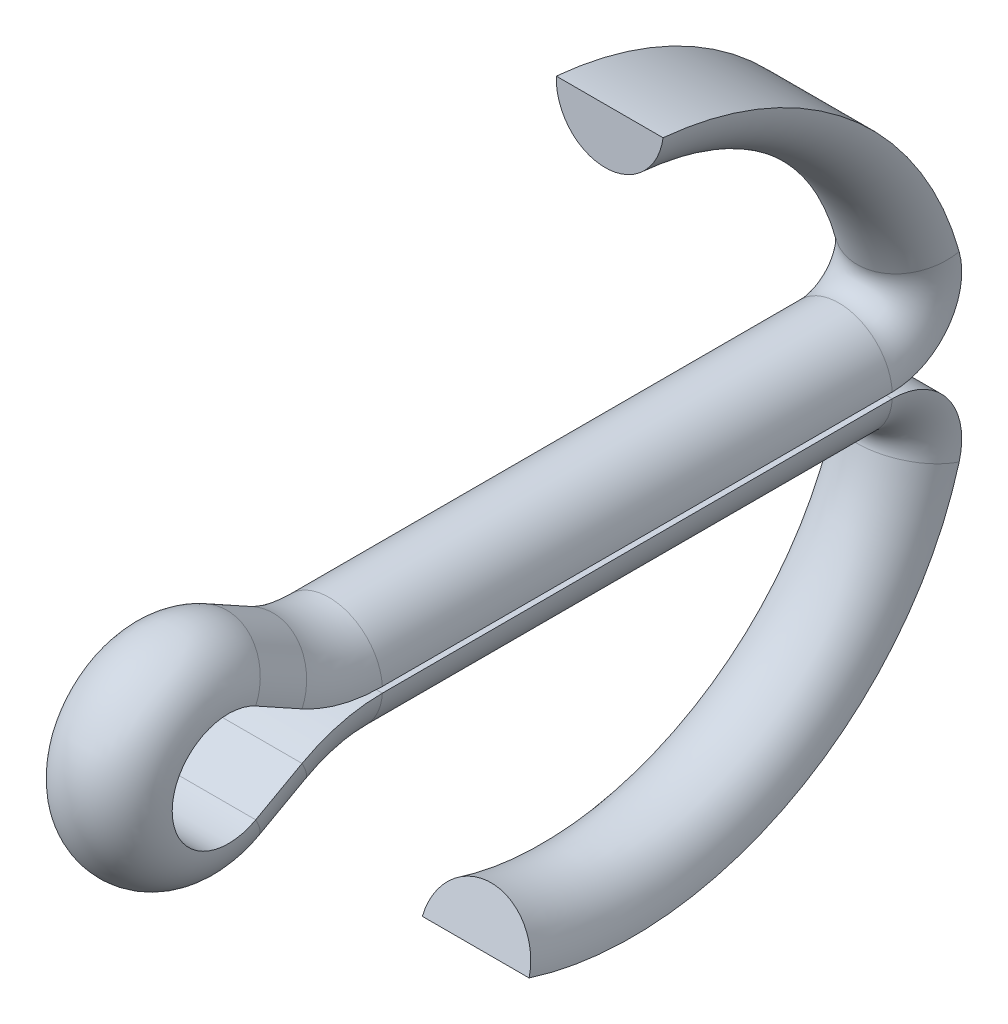
ISO-10303-21;
HEADER;
FILE_DESCRIPTION(('STEP AP214'),'2;1');
FILE_NAME('part.step','',(''),(''),'','','');
FILE_SCHEMA(('AUTOMOTIVE_DESIGN { 1 0 10303 214 1 1 1 1 }'));
ENDSEC;
DATA;
#1=APPLICATION_CONTEXT('core data for automotive mechanical design processes');
#2=APPLICATION_PROTOCOL_DEFINITION('international standard','automotive_design',2000,#1);
#3=PRODUCT_CONTEXT('',#1,'mechanical');
#4=PRODUCT('Part','Part','',(#3));
#5=PRODUCT_RELATED_PRODUCT_CATEGORY('part','',(#4));
#6=PRODUCT_DEFINITION_FORMATION('','',#4);
#7=PRODUCT_DEFINITION_CONTEXT('part definition',#1,'design');
#8=PRODUCT_DEFINITION('design','',#6,#7);
#9=PRODUCT_DEFINITION_SHAPE('','',#8);
#10=(LENGTH_UNIT() NAMED_UNIT(*) SI_UNIT(.MILLI.,.METRE.));
#11=(NAMED_UNIT(*) PLANE_ANGLE_UNIT() SI_UNIT($,.RADIAN.));
#12=(NAMED_UNIT(*) SI_UNIT($,.STERADIAN.) SOLID_ANGLE_UNIT());
#13=UNCERTAINTY_MEASURE_WITH_UNIT(LENGTH_MEASURE(1.E-05),#10,'distance_accuracy_value','');
#14=(GEOMETRIC_REPRESENTATION_CONTEXT(3) GLOBAL_UNCERTAINTY_ASSIGNED_CONTEXT((#13)) GLOBAL_UNIT_ASSIGNED_CONTEXT((#10,
#11,#12)) REPRESENTATION_CONTEXT('',''));
#15=CARTESIAN_POINT('',(0.,0.,0.));
#16=DIRECTION('',(0.,0.,1.));
#17=DIRECTION('',(1.,0.,0.));
#18=AXIS2_PLACEMENT_3D('',#15,#16,#17);
#19=CARTESIAN_POINT('',(0.,-0.415827632785369,-18.2608571356044));
#20=DIRECTION('',(0.,0.,1.));
#21=DIRECTION('',(0.,-1.,0.));
#22=AXIS2_PLACEMENT_3D('',#19,#20,#21);
#23=CYLINDRICAL_SURFACE('',#22,0.370571428571429);
#24=DIRECTION('',(0.,0.,1.));
#25=VECTOR('',#24,1.);
#26=CARTESIAN_POINT('',(0.370000000000001,-0.395256204213941,-18.2608571356044));
#27=LINE('',#26,#25);
#28=CARTESIAN_POINT('',(0.370000000000001,-0.395256204213941,-15.6008571356044));
#29=VERTEX_POINT('',#28);
#30=CARTESIAN_POINT('',(0.370000000000001,-0.395256204213941,-12.0673450358872));
#31=VERTEX_POINT('',#30);
#32=EDGE_CURVE('E239',#29,#31,#27,.T.);
#33=ORIENTED_EDGE('',*,*,#32,.F.);
#34=CARTESIAN_POINT('',(0.,-0.41582763278537,-15.6008571356044));
#35=DIRECTION('',(0.,0.,-1.));
#36=DIRECTION('',(-1.,0.,0.));
#37=AXIS2_PLACEMENT_3D('',#34,#35,#36);
#38=CIRCLE('',#37,0.370571428571429);
#39=CARTESIAN_POINT('',(-0.369999999999999,-0.395256204213941,-15.6008571356044));
#40=VERTEX_POINT('',#39);
#41=EDGE_CURVE('E243',#29,#40,#38,.F.);
#42=ORIENTED_EDGE('',*,*,#41,.T.);
#43=DIRECTION('',(0.,0.,1.));
#44=VECTOR('',#43,1.);
#45=CARTESIAN_POINT('',(-0.369999999999999,-0.395256204213941,-18.2608571356044));
#46=LINE('',#45,#44);
#47=CARTESIAN_POINT('',(-0.369999999999999,-0.395256204213941,-12.0673450358872));
#48=VERTEX_POINT('',#47);
#49=EDGE_CURVE('E168',#40,#48,#46,.T.);
#50=ORIENTED_EDGE('',*,*,#49,.T.);
#51=CARTESIAN_POINT('',(0.,-0.41582763278537,-12.0673450358872));
#52=DIRECTION('',(0.,0.,1.));
#53=DIRECTION('',(-1.,0.,0.));
#54=AXIS2_PLACEMENT_3D('',#51,#52,#53);
#55=CIRCLE('',#54,0.370571428571429);
#56=EDGE_CURVE('E242',#31,#48,#55,.T.);
#57=ORIENTED_EDGE('',*,*,#56,.F.);
#58=EDGE_LOOP('',(#33,#42,#50,#57));
#59=FACE_BOUND('',#58,.T.);
#60=ADVANCED_FACE('F40',(#59),#23,.T.);
#61=CARTESIAN_POINT('',(-0.369999999999999,-0.395256204213941,-18.2608571356044));
#62=DIRECTION('',(0.,-1.,0.));
#63=DIRECTION('',(0.,0.,-1.));
#64=AXIS2_PLACEMENT_3D('',#61,#62,#63);
#65=PLANE('',#64);
#66=ORIENTED_EDGE('',*,*,#49,.F.);
#67=DIRECTION('',(1.,0.,0.));
#68=VECTOR('',#67,1.);
#69=CARTESIAN_POINT('',(-0.369999999999999,-0.395256204213941,-15.6008571356044));
#70=LINE('',#69,#68);
#71=EDGE_CURVE('E140',#40,#29,#70,.T.);
#72=ORIENTED_EDGE('',*,*,#71,.T.);
#73=ORIENTED_EDGE('',*,*,#32,.T.);
#74=DIRECTION('',(1.,0.,0.));
#75=VECTOR('',#74,1.);
#76=CARTESIAN_POINT('',(-0.369999999999999,-0.395256204213941,-12.0673450358872));
#77=LINE('',#76,#75);
#78=EDGE_CURVE('E163',#48,#31,#77,.T.);
#79=ORIENTED_EDGE('',*,*,#78,.F.);
#80=EDGE_LOOP('',(#66,#72,#73,#79));
#81=FACE_BOUND('',#80,.T.);
#82=ADVANCED_FACE('F327',(#81),#65,.T.);
#83=CARTESIAN_POINT('',(0.,-0.414684775642511,-12.0673450358872));
#84=DIRECTION('',(0.,0.,-1.));
#85=DIRECTION('',(0.,1.,0.));
#86=AXIS2_PLACEMENT_3D('',#83,#84,#85);
#87=CYLINDRICAL_SURFACE('',#86,0.370571428571429);
#88=DIRECTION('',(0.,0.,-1.));
#89=VECTOR('',#88,1.);
#90=CARTESIAN_POINT('',(-0.369999999999999,-0.43525620421394,-12.0673450358872));
#91=LINE('',#90,#89);
#92=CARTESIAN_POINT('',(-0.369999999999999,-0.435256204213939,-12.0673450358872));
#93=VERTEX_POINT('',#92);
#94=CARTESIAN_POINT('',(-0.369999999999999,-0.43525620421394,-15.6008571356044));
#95=VERTEX_POINT('',#94);
#96=EDGE_CURVE('E49',#93,#95,#91,.T.);
#97=ORIENTED_EDGE('',*,*,#96,.T.);
#98=CARTESIAN_POINT('',(0.,-0.414684775642512,-15.6008571356044));
#99=DIRECTION('',(0.,0.,-1.));
#100=DIRECTION('',(-1.,0.,0.));
#101=AXIS2_PLACEMENT_3D('',#98,#99,#100);
#102=CIRCLE('',#101,0.370571428571429);
#103=CARTESIAN_POINT('',(0.370000000000001,-0.43525620421394,-15.6008571356044));
#104=VERTEX_POINT('',#103);
#105=EDGE_CURVE('E130',#95,#104,#102,.F.);
#106=ORIENTED_EDGE('',*,*,#105,.T.);
#107=DIRECTION('',(0.,0.,-1.));
#108=VECTOR('',#107,1.);
#109=CARTESIAN_POINT('',(0.370000000000001,-0.43525620421394,-12.0673450358872));
#110=LINE('',#109,#108);
#111=CARTESIAN_POINT('',(0.370000000000001,-0.435256204213939,-12.0673450358872));
#112=VERTEX_POINT('',#111);
#113=EDGE_CURVE('E62',#112,#104,#110,.T.);
#114=ORIENTED_EDGE('',*,*,#113,.F.);
#115=CARTESIAN_POINT('',(0.,-0.414684775642511,-12.0673450358872));
#116=DIRECTION('',(0.,0.,-1.));
#117=DIRECTION('',(-1.,0.,0.));
#118=AXIS2_PLACEMENT_3D('',#115,#116,#117);
#119=CIRCLE('',#118,0.370571428571429);
#120=EDGE_CURVE('E153',#112,#93,#119,.T.);
#121=ORIENTED_EDGE('',*,*,#120,.T.);
#122=EDGE_LOOP('',(#97,#106,#114,#121));
#123=FACE_BOUND('',#122,.T.);
#124=ADVANCED_FACE('F151',(#123),#87,.T.);
#125=CARTESIAN_POINT('',(-0.369999999999999,-0.43525620421394,-12.0673450358872));
#126=DIRECTION('',(0.,1.,0.));
#127=DIRECTION('',(0.,0.,1.));
#128=AXIS2_PLACEMENT_3D('',#125,#126,#127);
#129=PLANE('',#128);
#130=ORIENTED_EDGE('',*,*,#113,.T.);
#131=DIRECTION('',(-1.,0.,0.));
#132=VECTOR('',#131,1.);
#133=CARTESIAN_POINT('',(-0.369999999999999,-0.43525620421394,-15.6008571356044));
#134=LINE('',#133,#132);
#135=EDGE_CURVE('E11',#104,#95,#134,.T.);
#136=ORIENTED_EDGE('',*,*,#135,.T.);
#137=ORIENTED_EDGE('',*,*,#96,.F.);
#138=DIRECTION('',(1.,0.,0.));
#139=VECTOR('',#138,1.);
#140=CARTESIAN_POINT('',(-0.369999999999999,-0.43525620421394,-12.0673450358872));
#141=LINE('',#140,#139);
#142=EDGE_CURVE('E157',#93,#112,#141,.T.);
#143=ORIENTED_EDGE('',*,*,#142,.T.);
#144=EDGE_LOOP('',(#130,#136,#137,#143));
#145=FACE_BOUND('',#144,.T.);
#146=ADVANCED_FACE('F42',(#145),#129,.T.);
#147=CARTESIAN_POINT('',(0.,0.754743795786059,-12.0673450358872));
#148=DIRECTION('',(-1.,0.,0.));
#149=DIRECTION('',(0.,0.,1.));
#150=AXIS2_PLACEMENT_3D('',#147,#148,#149);
#151=TOROIDAL_SURFACE('',#150,1.17057142857145,0.370571428571429);
#152=CARTESIAN_POINT('',(-0.369999999999999,0.754743795786059,-12.0673450358872));
#153=DIRECTION('',(-1.,0.,0.));
#154=DIRECTION('',(0.,-1.,0.));
#155=AXIS2_PLACEMENT_3D('',#152,#153,#154);
#156=CIRCLE('',#155,1.15000000000003);
#157=CARTESIAN_POINT('',(-0.369999999999999,-0.251599113438894,-11.5107716363677));
#158=VERTEX_POINT('',#157);
#159=EDGE_CURVE('E174',#48,#158,#156,.T.);
#160=ORIENTED_EDGE('',*,*,#159,.T.);
#161=CARTESIAN_POINT('',(0.,-0.269600775417553,-11.5008155407738));
#162=DIRECTION('',(0.,0.4839768691474,0.875080790630374));
#163=DIRECTION('',(-1.,0.,0.));
#164=AXIS2_PLACEMENT_3D('',#161,#162,#163);
#165=CIRCLE('',#164,0.370571428571429);
#166=CARTESIAN_POINT('',(0.370000000000001,-0.251599113438894,-11.5107716363677));
#167=VERTEX_POINT('',#166);
#168=EDGE_CURVE('E232',#167,#158,#165,.T.);
#169=ORIENTED_EDGE('',*,*,#168,.F.);
#170=CARTESIAN_POINT('',(0.370000000000001,0.754743795786059,-12.0673450358872));
#171=DIRECTION('',(-1.,0.,0.));
#172=DIRECTION('',(0.,-1.,0.));
#173=AXIS2_PLACEMENT_3D('',#170,#171,#172);
#174=CIRCLE('',#173,1.15000000000003);
#175=EDGE_CURVE('E167',#31,#167,#174,.T.);
#176=ORIENTED_EDGE('',*,*,#175,.F.);
#177=ORIENTED_EDGE('',*,*,#56,.T.);
#178=EDGE_LOOP('',(#160,#169,#176,#177));
#179=FACE_BOUND('',#178,.T.);
#180=ADVANCED_FACE('F323',(#179),#151,.T.);
#181=CARTESIAN_POINT('',(0.,0.754743795786059,-12.0673450358872));
#182=DIRECTION('',(-1.,0.,0.));
#183=DIRECTION('',(0.,0.,1.));
#184=AXIS2_PLACEMENT_3D('',#181,#182,#183);
#185=CYLINDRICAL_SURFACE('',#184,1.15000000000003);
#186=DIRECTION('',(1.,0.,0.));
#187=VECTOR('',#186,1.);
#188=CARTESIAN_POINT('',(-0.369999999999999,-0.251599113438871,-11.5107716363677));
#189=LINE('',#188,#187);
#190=EDGE_CURVE('E169',#158,#167,#189,.T.);
#191=ORIENTED_EDGE('',*,*,#190,.F.);
#192=ORIENTED_EDGE('',*,*,#159,.F.);
#193=ORIENTED_EDGE('',*,*,#78,.T.);
#194=ORIENTED_EDGE('',*,*,#175,.T.);
#195=EDGE_LOOP('',(#191,#192,#193,#194));
#196=FACE_BOUND('',#195,.T.);
#197=ADVANCED_FACE('F341',(#196),#185,.T.);
#198=CARTESIAN_POINT('',(0.,-0.269600775417553,-11.5008155407738));
#199=DIRECTION('',(0.,0.483976869147397,0.875080790630375));
#200=DIRECTION('',(0.,-0.875080790630376,0.483976869147397));
#201=AXIS2_PLACEMENT_3D('',#198,#199,#200);
#202=CYLINDRICAL_SURFACE('',#201,0.370571428571429);
#203=DIRECTION('',(0.,0.483976869147397,0.875080790630375));
#204=VECTOR('',#203,1.);
#205=CARTESIAN_POINT('',(-0.369999999999999,-0.251599113438871,-11.5107716363677));
#206=LINE('',#205,#204);
#207=CARTESIAN_POINT('',(-0.369999999999999,-0.073974695868094,-11.1896081145719));
#208=VERTEX_POINT('',#207);
#209=EDGE_CURVE('E180',#158,#208,#206,.T.);
#210=ORIENTED_EDGE('',*,*,#209,.T.);
#211=CARTESIAN_POINT('',(0.,-0.0919763578467761,-11.179652018978));
#212=DIRECTION('',(0.,0.483976869147397,0.875080790630375));
#213=DIRECTION('',(-1.,0.,0.));
#214=AXIS2_PLACEMENT_3D('',#211,#212,#213);
#215=CIRCLE('',#214,0.370571428571429);
#216=CARTESIAN_POINT('',(0.370000000000001,-0.073974695868094,-11.1896081145719));
#217=VERTEX_POINT('',#216);
#218=EDGE_CURVE('E222',#217,#208,#215,.T.);
#219=ORIENTED_EDGE('',*,*,#218,.F.);
#220=DIRECTION('',(0.,0.483976869147397,0.875080790630375));
#221=VECTOR('',#220,1.);
#222=CARTESIAN_POINT('',(0.370000000000001,-0.251599113438871,-11.5107716363677));
#223=LINE('',#222,#221);
#224=EDGE_CURVE('E173',#167,#217,#223,.T.);
#225=ORIENTED_EDGE('',*,*,#224,.F.);
#226=ORIENTED_EDGE('',*,*,#168,.T.);
#227=EDGE_LOOP('',(#210,#219,#225,#226));
#228=FACE_BOUND('',#227,.T.);
#229=ADVANCED_FACE('F343',(#228),#202,.T.);
#230=CARTESIAN_POINT('',(-0.369999999999999,-0.251599113438871,-11.5107716363677));
#231=DIRECTION('',(0.,-0.875080790630375,0.483976869147397));
#232=DIRECTION('',(0.,-0.483976869147397,-0.875080790630375));
#233=AXIS2_PLACEMENT_3D('',#230,#231,#232);
#234=PLANE('',#233);
#235=DIRECTION('',(1.,0.,0.));
#236=VECTOR('',#235,1.);
#237=CARTESIAN_POINT('',(-0.369999999999999,-0.0739746958680944,-11.1896081145719));
#238=LINE('',#237,#236);
#239=EDGE_CURVE('E175',#208,#217,#238,.T.);
#240=ORIENTED_EDGE('',*,*,#239,.F.);
#241=ORIENTED_EDGE('',*,*,#209,.F.);
#242=ORIENTED_EDGE('',*,*,#190,.T.);
#243=ORIENTED_EDGE('',*,*,#224,.T.);
#244=EDGE_LOOP('',(#240,#241,#242,#243));
#245=FACE_BOUND('',#244,.T.);
#246=ADVANCED_FACE('F346',(#245),#234,.T.);
#247=CARTESIAN_POINT('',(0.,-0.415256204213941,-11.0008571356044));
#248=DIRECTION('',(1.,0.,0.));
#249=DIRECTION('',(0.,0.,-1.));
#250=AXIS2_PLACEMENT_3D('',#247,#248,#249);
#251=DEGENERATE_TOROIDAL_SURFACE('',#250,0.369428571428571,0.370571428571429,.T.);
#252=CARTESIAN_POINT('',(-0.369999999999999,-0.415256204213941,-11.0008571356044));
#253=DIRECTION('',(1.,0.,0.));
#254=DIRECTION('',(0.,0.875080790630376,-0.483976869147396));
#255=AXIS2_PLACEMENT_3D('',#252,#253,#254);
#256=CIRCLE('',#255,0.389999999999999);
#257=CARTESIAN_POINT('',(-0.369999999999999,-0.756537712559787,-11.1896081145719));
#258=VERTEX_POINT('',#257);
#259=EDGE_CURVE('E186',#208,#258,#256,.T.);
#260=ORIENTED_EDGE('',*,*,#259,.T.);
#261=CARTESIAN_POINT('',(0.,-0.738536050581105,-11.179652018978));
#262=DIRECTION('',(0.,0.483976869147396,-0.875080790630376));
#263=DIRECTION('',(-1.,0.,0.));
#264=AXIS2_PLACEMENT_3D('',#261,#262,#263);
#265=CIRCLE('',#264,0.370571428571429);
#266=CARTESIAN_POINT('',(0.370000000000001,-0.756537712559787,-11.1896081145719));
#267=VERTEX_POINT('',#266);
#268=EDGE_CURVE('E212',#267,#258,#265,.T.);
#269=ORIENTED_EDGE('',*,*,#268,.F.);
#270=CARTESIAN_POINT('',(0.370000000000001,-0.415256204213941,-11.0008571356044));
#271=DIRECTION('',(1.,0.,0.));
#272=DIRECTION('',(0.,0.875080790630376,-0.483976869147396));
#273=AXIS2_PLACEMENT_3D('',#270,#271,#272);
#274=CIRCLE('',#273,0.389999999999999);
#275=EDGE_CURVE('E179',#217,#267,#274,.T.);
#276=ORIENTED_EDGE('',*,*,#275,.F.);
#277=ORIENTED_EDGE('',*,*,#218,.T.);
#278=EDGE_LOOP('',(#260,#269,#276,#277));
#279=FACE_BOUND('',#278,.T.);
#280=ADVANCED_FACE('F348',(#279),#251,.T.);
#281=CARTESIAN_POINT('',(0.,-0.415256204213941,-11.0008571356044));
#282=DIRECTION('',(1.,0.,0.));
#283=DIRECTION('',(0.,0.,-1.));
#284=AXIS2_PLACEMENT_3D('',#281,#282,#283);
#285=CYLINDRICAL_SURFACE('',#284,0.389999999999999);
#286=DIRECTION('',(1.,0.,0.));
#287=VECTOR('',#286,1.);
#288=CARTESIAN_POINT('',(-0.369999999999999,-0.756537712559787,-11.1896081145719));
#289=LINE('',#288,#287);
#290=EDGE_CURVE('E181',#258,#267,#289,.T.);
#291=ORIENTED_EDGE('',*,*,#290,.F.);
#292=ORIENTED_EDGE('',*,*,#259,.F.);
#293=ORIENTED_EDGE('',*,*,#239,.T.);
#294=ORIENTED_EDGE('',*,*,#275,.T.);
#295=EDGE_LOOP('',(#291,#292,#293,#294));
#296=FACE_BOUND('',#295,.T.);
#297=ADVANCED_FACE('F351',(#296),#285,.F.);
#298=CARTESIAN_POINT('',(0.,-0.738536050581106,-11.179652018978));
#299=DIRECTION('',(0.,0.483976869147397,-0.875080790630375));
#300=DIRECTION('',(0.,0.875080790630376,0.483976869147397));
#301=AXIS2_PLACEMENT_3D('',#298,#299,#300);
#302=CYLINDRICAL_SURFACE('',#301,0.370571428571429);
#303=DIRECTION('',(0.,0.483976869147397,-0.875080790630375));
#304=VECTOR('',#303,1.);
#305=CARTESIAN_POINT('',(-0.369999999999999,-0.756537712559788,-11.1896081145719));
#306=LINE('',#305,#304);
#307=CARTESIAN_POINT('',(-0.369999999999999,-0.57891329498901,-11.5107716363677));
#308=VERTEX_POINT('',#307);
#309=EDGE_CURVE('E190',#258,#308,#306,.T.);
#310=ORIENTED_EDGE('',*,*,#309,.T.);
#311=CARTESIAN_POINT('',(0.,-0.560911633010328,-11.5008155407738));
#312=DIRECTION('',(0.,0.483976869147397,-0.875080790630375));
#313=DIRECTION('',(-1.,0.,0.));
#314=AXIS2_PLACEMENT_3D('',#311,#312,#313);
#315=CIRCLE('',#314,0.370571428571429);
#316=CARTESIAN_POINT('',(0.370000000000001,-0.57891329498901,-11.5107716363677));
#317=VERTEX_POINT('',#316);
#318=EDGE_CURVE('E203',#317,#308,#315,.T.);
#319=ORIENTED_EDGE('',*,*,#318,.F.);
#320=DIRECTION('',(0.,0.483976869147397,-0.875080790630375));
#321=VECTOR('',#320,1.);
#322=CARTESIAN_POINT('',(0.370000000000001,-0.756537712559788,-11.1896081145719));
#323=LINE('',#322,#321);
#324=EDGE_CURVE('E185',#267,#317,#323,.T.);
#325=ORIENTED_EDGE('',*,*,#324,.F.);
#326=ORIENTED_EDGE('',*,*,#268,.T.);
#327=EDGE_LOOP('',(#310,#319,#325,#326));
#328=FACE_BOUND('',#327,.T.);
#329=ADVANCED_FACE('F353',(#328),#302,.T.);
#330=CARTESIAN_POINT('',(-0.369999999999999,-0.756537712559788,-11.1896081145719));
#331=DIRECTION('',(0.,0.875080790630375,0.483976869147397));
#332=DIRECTION('',(0.,-0.483976869147397,0.875080790630375));
#333=AXIS2_PLACEMENT_3D('',#330,#331,#332);
#334=PLANE('',#333);
#335=DIRECTION('',(1.,0.,0.));
#336=VECTOR('',#335,1.);
#337=CARTESIAN_POINT('',(-0.369999999999999,-0.57891329498901,-11.5107716363677));
#338=LINE('',#337,#336);
#339=EDGE_CURVE('E187',#308,#317,#338,.T.);
#340=ORIENTED_EDGE('',*,*,#339,.F.);
#341=ORIENTED_EDGE('',*,*,#309,.F.);
#342=ORIENTED_EDGE('',*,*,#290,.T.);
#343=ORIENTED_EDGE('',*,*,#324,.T.);
#344=EDGE_LOOP('',(#340,#341,#342,#343));
#345=FACE_BOUND('',#344,.T.);
#346=ADVANCED_FACE('F356',(#345),#334,.T.);
#347=CARTESIAN_POINT('',(0.,-1.58525620421394,-12.0673450358872));
#348=DIRECTION('',(-1.,0.,0.));
#349=DIRECTION('',(0.,0.,1.));
#350=AXIS2_PLACEMENT_3D('',#347,#348,#349);
#351=TOROIDAL_SURFACE('',#350,1.17057142857143,0.370571428571429);
#352=CARTESIAN_POINT('',(-0.369999999999999,-1.58525620421394,-12.0673450358872));
#353=DIRECTION('',(-1.,0.,0.));
#354=DIRECTION('',(0.,0.875080790630374,0.4839768691474));
#355=AXIS2_PLACEMENT_3D('',#352,#353,#354);
#356=CIRCLE('',#355,1.15);
#357=EDGE_CURVE('E192',#308,#93,#356,.T.);
#358=ORIENTED_EDGE('',*,*,#357,.T.);
#359=ORIENTED_EDGE('',*,*,#120,.F.);
#360=CARTESIAN_POINT('',(0.370000000000001,-1.58525620421394,-12.0673450358872));
#361=DIRECTION('',(-1.,0.,0.));
#362=DIRECTION('',(0.,0.875080790630374,0.4839768691474));
#363=AXIS2_PLACEMENT_3D('',#360,#361,#362);
#364=CIRCLE('',#363,1.15);
#365=EDGE_CURVE('E160',#317,#112,#364,.T.);
#366=ORIENTED_EDGE('',*,*,#365,.F.);
#367=ORIENTED_EDGE('',*,*,#318,.T.);
#368=EDGE_LOOP('',(#358,#359,#366,#367));
#369=FACE_BOUND('',#368,.T.);
#370=ADVANCED_FACE('F358',(#369),#351,.T.);
#371=CARTESIAN_POINT('',(0.,-1.58525620421394,-12.0673450358872));
#372=DIRECTION('',(-1.,0.,0.));
#373=DIRECTION('',(0.,0.,1.));
#374=AXIS2_PLACEMENT_3D('',#371,#372,#373);
#375=CYLINDRICAL_SURFACE('',#374,1.15);
#376=ORIENTED_EDGE('',*,*,#142,.F.);
#377=ORIENTED_EDGE('',*,*,#357,.F.);
#378=ORIENTED_EDGE('',*,*,#339,.T.);
#379=ORIENTED_EDGE('',*,*,#365,.T.);
#380=EDGE_LOOP('',(#376,#377,#378,#379));
#381=FACE_BOUND('',#380,.T.);
#382=ADVANCED_FACE('F361',(#381),#375,.T.);
#383=CARTESIAN_POINT('',(0.,1.9456778024067,-14.0143975634896));
#384=DIRECTION('',(0.,0.0900797273229016,0.995934557451157));
#385=DIRECTION('',(-1.,0.,0.));
#386=AXIS2_PLACEMENT_3D('',#383,#384,#385);
#387=PLANE('',#386);
#388=CARTESIAN_POINT('',(0.,1.9456778024067,-14.0143975634896));
#389=DIRECTION('',(0.,0.0900797273229016,0.995934557451157));
#390=DIRECTION('',(-1.,0.,0.));
#391=AXIS2_PLACEMENT_3D('',#388,#389,#390);
#392=CIRCLE('',#391,0.370571428571429);
#393=CARTESIAN_POINT('',(-0.369999999999999,1.92519000579628,-14.0125444948132));
#394=VERTEX_POINT('',#393);
#395=CARTESIAN_POINT('',(0.370000000000001,1.92519000579628,-14.0125444948132));
#396=VERTEX_POINT('',#395);
#397=EDGE_CURVE('E266',#394,#396,#392,.T.);
#398=ORIENTED_EDGE('',*,*,#397,.T.);
#399=DIRECTION('',(-1.,0.,0.));
#400=VECTOR('',#399,1.);
#401=CARTESIAN_POINT('',(0.370000000000001,1.92519000579628,-14.0125444948132));
#402=LINE('',#401,#400);
#403=EDGE_CURVE('E261',#396,#394,#402,.T.);
#404=ORIENTED_EDGE('',*,*,#403,.T.);
#405=EDGE_LOOP('',(#398,#404));
#406=FACE_BOUND('',#405,.T.);
#407=ADVANCED_FACE('F338',(#406),#387,.T.);
#408=CARTESIAN_POINT('',(0.,-0.415256204213941,-13.8008571356044));
#409=DIRECTION('',(-1.,0.,0.));
#410=DIRECTION('',(0.,0.,1.));
#411=AXIS2_PLACEMENT_3D('',#408,#409,#410);
#412=TOROIDAL_SURFACE('',#411,2.37057142857143,0.370571428571429);
#413=CARTESIAN_POINT('',(0.370000000000001,-0.415256204213941,-13.8008571356044));
#414=DIRECTION('',(-1.,0.,0.));
#415=DIRECTION('',(0.,0.995934557451157,-0.0900797273229021));
#416=AXIS2_PLACEMENT_3D('',#413,#414,#415);
#417=CIRCLE('',#416,2.35);
#418=CARTESIAN_POINT('',(0.370000000000001,0.215406330081352,-16.0646514654489));
#419=VERTEX_POINT('',#418);
#420=EDGE_CURVE('E260',#396,#419,#417,.T.);
#421=ORIENTED_EDGE('',*,*,#420,.F.);
#422=ORIENTED_EDGE('',*,*,#397,.F.);
#423=CARTESIAN_POINT('',(-0.369999999999999,-0.415256204213941,-13.8008571356044));
#424=DIRECTION('',(-1.,0.,0.));
#425=DIRECTION('',(0.,0.995934557451157,-0.0900797273229021));
#426=AXIS2_PLACEMENT_3D('',#423,#424,#425);
#427=CIRCLE('',#426,2.35);
#428=CARTESIAN_POINT('',(-0.369999999999999,0.215406330081352,-16.0646514654489));
#429=VERTEX_POINT('',#428);
#430=EDGE_CURVE('E265',#394,#429,#427,.T.);
#431=ORIENTED_EDGE('',*,*,#430,.T.);
#432=CARTESIAN_POINT('',(0.,0.220927023390684,-16.0844682668774));
#433=DIRECTION('',(0.,0.963316736104055,0.268367035870337));
#434=DIRECTION('',(-1.,0.,0.));
#435=AXIS2_PLACEMENT_3D('',#432,#433,#434);
#436=CIRCLE('',#435,0.370571428571429);
#437=EDGE_CURVE('E275',#429,#419,#436,.T.);
#438=ORIENTED_EDGE('',*,*,#437,.T.);
#439=EDGE_LOOP('',(#421,#422,#431,#438));
#440=FACE_BOUND('',#439,.T.);
#441=ADVANCED_FACE('F380',(#440),#412,.T.);
#442=CARTESIAN_POINT('',(0.,-0.415256204213941,-13.8008571356044));
#443=DIRECTION('',(-1.,0.,0.));
#444=DIRECTION('',(0.,0.,1.));
#445=AXIS2_PLACEMENT_3D('',#442,#443,#444);
#446=CYLINDRICAL_SURFACE('',#445,2.35);
#447=DIRECTION('',(-1.,0.,0.));
#448=VECTOR('',#447,1.);
#449=CARTESIAN_POINT('',(0.370000000000001,0.215406330081351,-16.0646514654489));
#450=LINE('',#449,#448);
#451=EDGE_CURVE('E255',#419,#429,#450,.T.);
#452=ORIENTED_EDGE('',*,*,#451,.T.);
#453=ORIENTED_EDGE('',*,*,#430,.F.);
#454=ORIENTED_EDGE('',*,*,#403,.F.);
#455=ORIENTED_EDGE('',*,*,#420,.T.);
#456=EDGE_LOOP('',(#452,#453,#454,#455));
#457=FACE_BOUND('',#456,.T.);
#458=ADVANCED_FACE('F443',(#457),#446,.T.);
#459=CARTESIAN_POINT('',(0.,0.0861994919885892,-15.6008571356044));
#460=DIRECTION('',(-1.,0.,0.));
#461=DIRECTION('',(0.,0.,1.));
#462=AXIS2_PLACEMENT_3D('',#459,#460,#461);
#463=TOROIDAL_SURFACE('',#462,0.502027124773959,0.370571428571429);
#464=CARTESIAN_POINT('',(0.370000000000001,0.0861994919885892,-15.6008571356044));
#465=DIRECTION('',(-1.,0.,0.));
#466=DIRECTION('',(0.,0.268367035870333,-0.963316736104056));
#467=AXIS2_PLACEMENT_3D('',#464,#465,#466);
#468=CIRCLE('',#467,0.48145569620253);
#469=EDGE_CURVE('E141',#419,#29,#468,.T.);
#470=ORIENTED_EDGE('',*,*,#469,.F.);
#471=ORIENTED_EDGE('',*,*,#437,.F.);
#472=CARTESIAN_POINT('',(-0.369999999999999,0.0861994919885892,-15.6008571356044));
#473=DIRECTION('',(-1.,0.,0.));
#474=DIRECTION('',(0.,0.268367035870333,-0.963316736104056));
#475=AXIS2_PLACEMENT_3D('',#472,#473,#474);
#476=CIRCLE('',#475,0.48145569620253);
#477=EDGE_CURVE('E259',#429,#40,#476,.T.);
#478=ORIENTED_EDGE('',*,*,#477,.T.);
#479=ORIENTED_EDGE('',*,*,#41,.F.);
#480=EDGE_LOOP('',(#470,#471,#478,#479));
#481=FACE_BOUND('',#480,.T.);
#482=ADVANCED_FACE('F320',(#481),#463,.T.);
#483=CARTESIAN_POINT('',(0.,0.0861994919885892,-15.6008571356044));
#484=DIRECTION('',(-1.,0.,0.));
#485=DIRECTION('',(0.,0.,1.));
#486=AXIS2_PLACEMENT_3D('',#483,#484,#485);
#487=CYLINDRICAL_SURFACE('',#486,0.48145569620253);
#488=ORIENTED_EDGE('',*,*,#71,.F.);
#489=ORIENTED_EDGE('',*,*,#477,.F.);
#490=ORIENTED_EDGE('',*,*,#451,.F.);
#491=ORIENTED_EDGE('',*,*,#469,.T.);
#492=EDGE_LOOP('',(#488,#489,#490,#491));
#493=FACE_BOUND('',#492,.T.);
#494=ADVANCED_FACE('F313',(#493),#487,.T.);
#495=CARTESIAN_POINT('',(0.,-2.67297698657009,-13.0781498872138));
#496=DIRECTION('',(0.,0.304866261222988,0.952395171537486));
#497=DIRECTION('',(-1.,0.,0.));
#498=AXIS2_PLACEMENT_3D('',#495,#496,#497);
#499=PLANE('',#498);
#500=CARTESIAN_POINT('',(0.,-2.67297698657009,-13.0781498872138));
#501=DIRECTION('',(0.,0.304866261222988,0.952395171537486));
#502=DIRECTION('',(-1.,0.,0.));
#503=AXIS2_PLACEMENT_3D('',#500,#501,#502);
#504=CIRCLE('',#503,0.370571428571429);
#505=CARTESIAN_POINT('',(0.370000000000001,-2.65338485732703,-13.0844214217304));
#506=VERTEX_POINT('',#505);
#507=CARTESIAN_POINT('',(-0.369999999999999,-2.65338485732703,-13.0844214217304));
#508=VERTEX_POINT('',#507);
#509=EDGE_CURVE('E295',#506,#508,#504,.T.);
#510=ORIENTED_EDGE('',*,*,#509,.T.);
#511=DIRECTION('',(1.,0.,0.));
#512=VECTOR('',#511,1.);
#513=CARTESIAN_POINT('',(-0.369999999999999,-2.65338485732703,-13.0844214217304));
#514=LINE('',#513,#512);
#515=EDGE_CURVE('E285',#508,#506,#514,.T.);
#516=ORIENTED_EDGE('',*,*,#515,.T.);
#517=EDGE_LOOP('',(#510,#516));
#518=FACE_BOUND('',#517,.T.);
#519=ADVANCED_FACE('F311',(#518),#499,.T.);
#520=CARTESIAN_POINT('',(0.,-0.91671190041647,-15.6008571356044));
#521=DIRECTION('',(-1.,0.,0.));
#522=DIRECTION('',(0.,0.,1.));
#523=AXIS2_PLACEMENT_3D('',#520,#521,#522);
#524=TOROIDAL_SURFACE('',#523,0.502027124773958,0.370571428571429);
#525=CARTESIAN_POINT('',(-0.369999999999999,-0.91671190041647,-15.6008571356044));
#526=DIRECTION('',(-1.,0.,0.));
#527=DIRECTION('',(0.,1.,0.));
#528=AXIS2_PLACEMENT_3D('',#525,#526,#527);
#529=CIRCLE('',#528,0.48145569620253);
#530=CARTESIAN_POINT('',(-0.369999999999999,-1.04591873850923,-16.0646514654489));
#531=VERTEX_POINT('',#530);
#532=EDGE_CURVE('E134',#95,#531,#529,.T.);
#533=ORIENTED_EDGE('',*,*,#532,.T.);
#534=CARTESIAN_POINT('',(0.,-1.05143943181857,-16.0844682668774));
#535=DIRECTION('',(0.,-0.963316736104054,0.268367035870341));
#536=DIRECTION('',(-1.,0.,0.));
#537=AXIS2_PLACEMENT_3D('',#534,#535,#536);
#538=CIRCLE('',#537,0.370571428571429);
#539=CARTESIAN_POINT('',(0.370000000000001,-1.04591873850923,-16.0646514654489));
#540=VERTEX_POINT('',#539);
#541=EDGE_CURVE('E149',#540,#531,#538,.T.);
#542=ORIENTED_EDGE('',*,*,#541,.F.);
#543=CARTESIAN_POINT('',(0.370000000000001,-0.91671190041647,-15.6008571356044));
#544=DIRECTION('',(-1.,0.,0.));
#545=DIRECTION('',(0.,1.,0.));
#546=AXIS2_PLACEMENT_3D('',#543,#544,#545);
#547=CIRCLE('',#546,0.48145569620253);
#548=EDGE_CURVE('E137',#104,#540,#547,.T.);
#549=ORIENTED_EDGE('',*,*,#548,.F.);
#550=ORIENTED_EDGE('',*,*,#105,.F.);
#551=EDGE_LOOP('',(#533,#542,#549,#550));
#552=FACE_BOUND('',#551,.T.);
#553=ADVANCED_FACE('F132',(#552),#524,.T.);
#554=CARTESIAN_POINT('',(0.,-0.91671190041647,-15.6008571356044));
#555=DIRECTION('',(-1.,0.,0.));
#556=DIRECTION('',(0.,0.,1.));
#557=AXIS2_PLACEMENT_3D('',#554,#555,#556);
#558=CYLINDRICAL_SURFACE('',#557,0.48145569620253);
#559=DIRECTION('',(1.,0.,0.));
#560=VECTOR('',#559,1.);
#561=CARTESIAN_POINT('',(-0.369999999999999,-1.04591873850923,-16.0646514654489));
#562=LINE('',#561,#560);
#563=EDGE_CURVE('E147',#531,#540,#562,.T.);
#564=ORIENTED_EDGE('',*,*,#563,.F.);
#565=ORIENTED_EDGE('',*,*,#532,.F.);
#566=ORIENTED_EDGE('',*,*,#135,.F.);
#567=ORIENTED_EDGE('',*,*,#548,.T.);
#568=EDGE_LOOP('',(#564,#565,#566,#567));
#569=FACE_BOUND('',#568,.T.);
#570=ADVANCED_FACE('F145',(#569),#558,.T.);
#571=CARTESIAN_POINT('',(0.,-0.415256204213941,-13.8008571356044));
#572=DIRECTION('',(-1.,0.,0.));
#573=DIRECTION('',(0.,0.,1.));
#574=AXIS2_PLACEMENT_3D('',#571,#572,#573);
#575=TOROIDAL_SURFACE('',#574,2.37057142857143,0.370571428571429);
#576=CARTESIAN_POINT('',(-0.369999999999999,-0.415256204213941,-13.8008571356044));
#577=DIRECTION('',(-1.,0.,0.));
#578=DIRECTION('',(0.,-0.268367035870337,-0.963316736104055));
#579=AXIS2_PLACEMENT_3D('',#576,#577,#578);
#580=CIRCLE('',#579,2.35);
#581=EDGE_CURVE('E288',#531,#508,#580,.T.);
#582=ORIENTED_EDGE('',*,*,#581,.T.);
#583=ORIENTED_EDGE('',*,*,#509,.F.);
#584=CARTESIAN_POINT('',(0.370000000000001,-0.415256204213941,-13.8008571356044));
#585=DIRECTION('',(-1.,0.,0.));
#586=DIRECTION('',(0.,-0.268367035870337,-0.963316736104055));
#587=AXIS2_PLACEMENT_3D('',#584,#585,#586);
#588=CIRCLE('',#587,2.35);
#589=EDGE_CURVE('E291',#540,#506,#588,.T.);
#590=ORIENTED_EDGE('',*,*,#589,.F.);
#591=ORIENTED_EDGE('',*,*,#541,.T.);
#592=EDGE_LOOP('',(#582,#583,#590,#591));
#593=FACE_BOUND('',#592,.T.);
#594=ADVANCED_FACE('F305',(#593),#575,.T.);
#595=CARTESIAN_POINT('',(0.,-0.415256204213941,-13.8008571356044));
#596=DIRECTION('',(-1.,0.,0.));
#597=DIRECTION('',(0.,0.,1.));
#598=AXIS2_PLACEMENT_3D('',#595,#596,#597);
#599=CYLINDRICAL_SURFACE('',#598,2.35);
#600=ORIENTED_EDGE('',*,*,#515,.F.);
#601=ORIENTED_EDGE('',*,*,#581,.F.);
#602=ORIENTED_EDGE('',*,*,#563,.T.);
#603=ORIENTED_EDGE('',*,*,#589,.T.);
#604=EDGE_LOOP('',(#600,#601,#602,#603));
#605=FACE_BOUND('',#604,.T.);
#606=ADVANCED_FACE('F309',(#605),#599,.T.);
#607=CLOSED_SHELL('',(#60,#82,#124,#146,#180,#197,#229,#246,#280,#297,#329,#346,#370,#382,#407,
#441,#458,#482,#494,#519,#553,#570,#594,#606));
#608=MANIFOLD_SOLID_BREP('B2',#607);
#609=ADVANCED_BREP_SHAPE_REPRESENTATION('',(#18,#608),#14);
#610=SHAPE_DEFINITION_REPRESENTATION(#9,#609);
ENDSEC;
END-ISO-10303-21;
